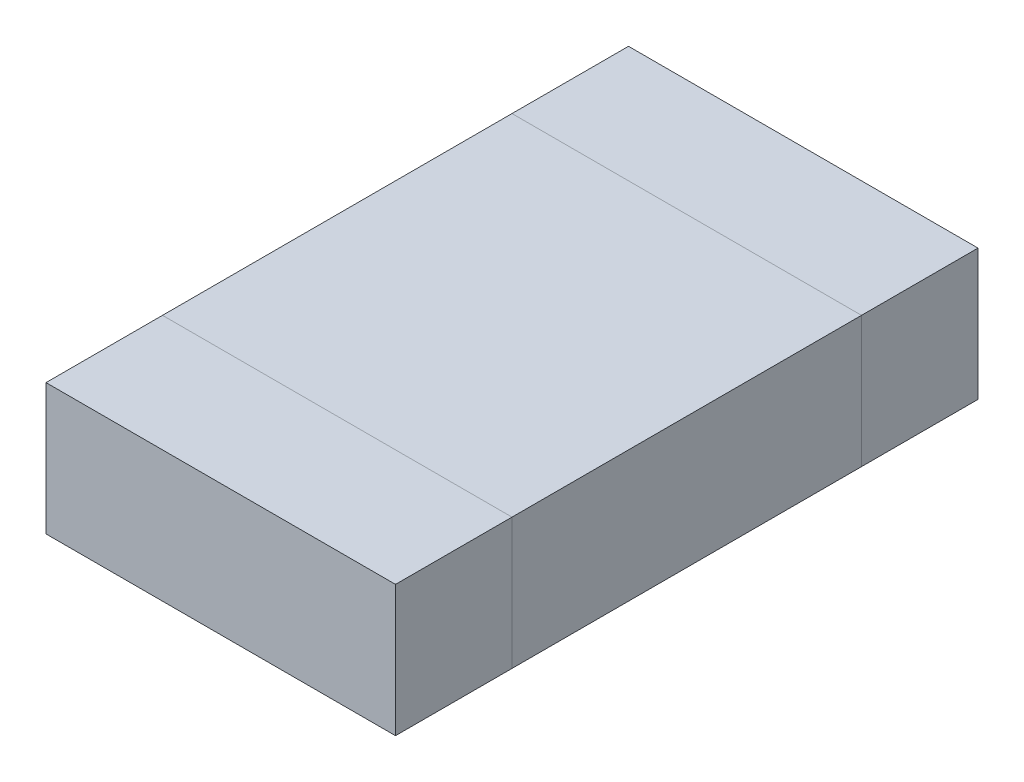
ISO-10303-21;
HEADER;
FILE_DESCRIPTION(('STEP AP214'),'2;1');
FILE_NAME('part.step','',(''),(''),'','','');
FILE_SCHEMA(('AUTOMOTIVE_DESIGN { 1 0 10303 214 1 1 1 1 }'));
ENDSEC;
DATA;
#1=APPLICATION_CONTEXT('core data for automotive mechanical design processes');
#2=APPLICATION_PROTOCOL_DEFINITION('international standard','automotive_design',2000,#1);
#3=PRODUCT_CONTEXT('',#1,'mechanical');
#4=PRODUCT('Part','Part','',(#3));
#5=PRODUCT_RELATED_PRODUCT_CATEGORY('part','',(#4));
#6=PRODUCT_DEFINITION_FORMATION('','',#4);
#7=PRODUCT_DEFINITION_CONTEXT('part definition',#1,'design');
#8=PRODUCT_DEFINITION('design','',#6,#7);
#9=PRODUCT_DEFINITION_SHAPE('','',#8);
#10=(LENGTH_UNIT() NAMED_UNIT(*) SI_UNIT(.MILLI.,.METRE.));
#11=(NAMED_UNIT(*) PLANE_ANGLE_UNIT() SI_UNIT($,.RADIAN.));
#12=(NAMED_UNIT(*) SI_UNIT($,.STERADIAN.) SOLID_ANGLE_UNIT());
#13=UNCERTAINTY_MEASURE_WITH_UNIT(LENGTH_MEASURE(1.E-05),#10,'distance_accuracy_value','');
#14=(GEOMETRIC_REPRESENTATION_CONTEXT(3) GLOBAL_UNCERTAINTY_ASSIGNED_CONTEXT((#13)) GLOBAL_UNIT_ASSIGNED_CONTEXT((#10,
#11,#12)) REPRESENTATION_CONTEXT('',''));
#15=CARTESIAN_POINT('',(0.,0.,0.));
#16=DIRECTION('',(0.,0.,1.));
#17=DIRECTION('',(1.,0.,0.));
#18=AXIS2_PLACEMENT_3D('',#15,#16,#17);
#19=CARTESIAN_POINT('',(0.,0.45,0.));
#20=DIRECTION('',(0.,1.,0.));
#21=DIRECTION('',(0.,0.,1.));
#22=AXIS2_PLACEMENT_3D('',#19,#20,#21);
#23=PLANE('',#22);
#24=DIRECTION('',(0.,0.,-1.));
#25=VECTOR('',#24,1.);
#26=CARTESIAN_POINT('',(-0.6,0.45,-0.6));
#27=LINE('',#26,#25);
#28=CARTESIAN_POINT('',(-0.6,0.45,-0.6));
#29=VERTEX_POINT('',#28);
#30=CARTESIAN_POINT('',(-0.6,0.45,-1.));
#31=VERTEX_POINT('',#30);
#32=EDGE_CURVE('E52',#29,#31,#27,.T.);
#33=ORIENTED_EDGE('',*,*,#32,.F.);
#34=DIRECTION('',(-1.,0.,0.));
#35=VECTOR('',#34,1.);
#36=CARTESIAN_POINT('',(-0.6,0.45,-0.6));
#37=LINE('',#36,#35);
#38=CARTESIAN_POINT('',(0.6,0.45,-0.6));
#39=VERTEX_POINT('',#38);
#40=EDGE_CURVE('E75',#39,#29,#37,.T.);
#41=ORIENTED_EDGE('',*,*,#40,.F.);
#42=DIRECTION('',(0.,0.,1.));
#43=VECTOR('',#42,1.);
#44=CARTESIAN_POINT('',(0.6,0.45,-0.6));
#45=LINE('',#44,#43);
#46=CARTESIAN_POINT('',(0.6,0.45,-1.));
#47=VERTEX_POINT('',#46);
#48=EDGE_CURVE('E80',#47,#39,#45,.T.);
#49=ORIENTED_EDGE('',*,*,#48,.F.);
#50=DIRECTION('',(1.,0.,0.));
#51=VECTOR('',#50,1.);
#52=CARTESIAN_POINT('',(-0.6,0.45,-1.));
#53=LINE('',#52,#51);
#54=EDGE_CURVE('E95',#31,#47,#53,.T.);
#55=ORIENTED_EDGE('',*,*,#54,.F.);
#56=EDGE_LOOP('',(#33,#41,#49,#55));
#57=FACE_BOUND('',#56,.T.);
#58=ADVANCED_FACE('F44',(#57),#23,.T.);
#59=CARTESIAN_POINT('',(0.,0.,0.));
#60=DIRECTION('',(0.,-1.,0.));
#61=DIRECTION('',(0.,0.,-1.));
#62=AXIS2_PLACEMENT_3D('',#59,#60,#61);
#63=PLANE('',#62);
#64=DIRECTION('',(0.,0.,-1.));
#65=VECTOR('',#64,1.);
#66=CARTESIAN_POINT('',(-0.6,0.,-0.6));
#67=LINE('',#66,#65);
#68=CARTESIAN_POINT('',(-0.6,0.,-0.6));
#69=VERTEX_POINT('',#68);
#70=CARTESIAN_POINT('',(-0.6,0.,-1.));
#71=VERTEX_POINT('',#70);
#72=EDGE_CURVE('E104',#69,#71,#67,.T.);
#73=ORIENTED_EDGE('',*,*,#72,.T.);
#74=DIRECTION('',(1.,0.,0.));
#75=VECTOR('',#74,1.);
#76=CARTESIAN_POINT('',(-0.6,0.,-1.));
#77=LINE('',#76,#75);
#78=CARTESIAN_POINT('',(0.6,0.,-1.));
#79=VERTEX_POINT('',#78);
#80=EDGE_CURVE('E93',#71,#79,#77,.T.);
#81=ORIENTED_EDGE('',*,*,#80,.T.);
#82=DIRECTION('',(0.,0.,1.));
#83=VECTOR('',#82,1.);
#84=CARTESIAN_POINT('',(0.6,0.,-0.6));
#85=LINE('',#84,#83);
#86=CARTESIAN_POINT('',(0.6,0.,-0.6));
#87=VERTEX_POINT('',#86);
#88=EDGE_CURVE('E96',#79,#87,#85,.T.);
#89=ORIENTED_EDGE('',*,*,#88,.T.);
#90=DIRECTION('',(-1.,0.,0.));
#91=VECTOR('',#90,1.);
#92=CARTESIAN_POINT('',(-0.6,0.,-0.6));
#93=LINE('',#92,#91);
#94=EDGE_CURVE('E101',#87,#69,#93,.T.);
#95=ORIENTED_EDGE('',*,*,#94,.T.);
#96=EDGE_LOOP('',(#73,#81,#89,#95));
#97=FACE_BOUND('',#96,.T.);
#98=ADVANCED_FACE('F103',(#97),#63,.T.);
#99=CARTESIAN_POINT('',(-0.6,1.71491106406735,-1.));
#100=DIRECTION('',(0.,0.,-1.));
#101=DIRECTION('',(-1.,0.,0.));
#102=AXIS2_PLACEMENT_3D('',#99,#100,#101);
#103=PLANE('',#102);
#104=DIRECTION('',(0.,-1.,0.));
#105=VECTOR('',#104,1.);
#106=CARTESIAN_POINT('',(-0.6,1.71491106406735,-1.));
#107=LINE('',#106,#105);
#108=EDGE_CURVE('E12',#31,#71,#107,.T.);
#109=ORIENTED_EDGE('',*,*,#108,.F.);
#110=ORIENTED_EDGE('',*,*,#54,.T.);
#111=DIRECTION('',(0.,-1.,0.));
#112=VECTOR('',#111,1.);
#113=CARTESIAN_POINT('',(0.6,1.71491106406735,-1.));
#114=LINE('',#113,#112);
#115=EDGE_CURVE('E90',#47,#79,#114,.T.);
#116=ORIENTED_EDGE('',*,*,#115,.T.);
#117=ORIENTED_EDGE('',*,*,#80,.F.);
#118=EDGE_LOOP('',(#109,#110,#116,#117));
#119=FACE_BOUND('',#118,.T.);
#120=ADVANCED_FACE('F91',(#119),#103,.T.);
#121=CARTESIAN_POINT('',(0.6,1.71491106406735,-0.6));
#122=DIRECTION('',(1.,0.,0.));
#123=DIRECTION('',(0.,0.,-1.));
#124=AXIS2_PLACEMENT_3D('',#121,#122,#123);
#125=PLANE('',#124);
#126=ORIENTED_EDGE('',*,*,#115,.F.);
#127=ORIENTED_EDGE('',*,*,#48,.T.);
#128=DIRECTION('',(0.,-1.,0.));
#129=VECTOR('',#128,1.);
#130=CARTESIAN_POINT('',(0.6,1.71491106406735,-0.6));
#131=LINE('',#130,#129);
#132=EDGE_CURVE('E85',#39,#87,#131,.T.);
#133=ORIENTED_EDGE('',*,*,#132,.T.);
#134=ORIENTED_EDGE('',*,*,#88,.F.);
#135=EDGE_LOOP('',(#126,#127,#133,#134));
#136=FACE_BOUND('',#135,.T.);
#137=ADVANCED_FACE('F97',(#136),#125,.T.);
#138=CARTESIAN_POINT('',(-0.6,1.71491106406735,-0.6));
#139=DIRECTION('',(0.,0.,1.));
#140=DIRECTION('',(1.,0.,0.));
#141=AXIS2_PLACEMENT_3D('',#138,#139,#140);
#142=PLANE('',#141);
#143=ORIENTED_EDGE('',*,*,#132,.F.);
#144=ORIENTED_EDGE('',*,*,#40,.T.);
#145=DIRECTION('',(0.,-1.,0.));
#146=VECTOR('',#145,1.);
#147=CARTESIAN_POINT('',(-0.6,1.71491106406735,-0.6));
#148=LINE('',#147,#146);
#149=EDGE_CURVE('E111',#29,#69,#148,.T.);
#150=ORIENTED_EDGE('',*,*,#149,.T.);
#151=ORIENTED_EDGE('',*,*,#94,.F.);
#152=EDGE_LOOP('',(#143,#144,#150,#151));
#153=FACE_BOUND('',#152,.T.);
#154=ADVANCED_FACE('F117',(#153),#142,.T.);
#155=CARTESIAN_POINT('',(-0.6,1.71491106406735,-0.6));
#156=DIRECTION('',(-1.,0.,0.));
#157=DIRECTION('',(0.,0.,1.));
#158=AXIS2_PLACEMENT_3D('',#155,#156,#157);
#159=PLANE('',#158);
#160=ORIENTED_EDGE('',*,*,#149,.F.);
#161=ORIENTED_EDGE('',*,*,#32,.T.);
#162=ORIENTED_EDGE('',*,*,#108,.T.);
#163=ORIENTED_EDGE('',*,*,#72,.F.);
#164=EDGE_LOOP('',(#160,#161,#162,#163));
#165=FACE_BOUND('',#164,.T.);
#166=ADVANCED_FACE('F118',(#165),#159,.T.);
#167=CLOSED_SHELL('',(#58,#98,#120,#137,#154,#166));
#168=MANIFOLD_SOLID_BREP('B2',#167);
#169=CARTESIAN_POINT('',(0.,0.45,0.));
#170=DIRECTION('',(0.,1.,0.));
#171=DIRECTION('',(0.,0.,1.));
#172=AXIS2_PLACEMENT_3D('',#169,#170,#171);
#173=PLANE('',#172);
#174=DIRECTION('',(0.,0.,-1.));
#175=VECTOR('',#174,1.);
#176=CARTESIAN_POINT('',(-0.6,0.45,0.6));
#177=LINE('',#176,#175);
#178=CARTESIAN_POINT('',(-0.6,0.45,1.));
#179=VERTEX_POINT('',#178);
#180=CARTESIAN_POINT('',(-0.6,0.45,0.6));
#181=VERTEX_POINT('',#180);
#182=EDGE_CURVE('E185',#179,#181,#177,.T.);
#183=ORIENTED_EDGE('',*,*,#182,.F.);
#184=DIRECTION('',(-1.,0.,0.));
#185=VECTOR('',#184,1.);
#186=CARTESIAN_POINT('',(-0.6,0.45,1.));
#187=LINE('',#186,#185);
#188=CARTESIAN_POINT('',(0.6,0.45,1.));
#189=VERTEX_POINT('',#188);
#190=EDGE_CURVE('E208',#189,#179,#187,.T.);
#191=ORIENTED_EDGE('',*,*,#190,.F.);
#192=DIRECTION('',(0.,0.,1.));
#193=VECTOR('',#192,1.);
#194=CARTESIAN_POINT('',(0.6,0.45,0.6));
#195=LINE('',#194,#193);
#196=CARTESIAN_POINT('',(0.6,0.45,0.6));
#197=VERTEX_POINT('',#196);
#198=EDGE_CURVE('E213',#197,#189,#195,.T.);
#199=ORIENTED_EDGE('',*,*,#198,.F.);
#200=DIRECTION('',(1.,0.,0.));
#201=VECTOR('',#200,1.);
#202=CARTESIAN_POINT('',(-0.6,0.45,0.6));
#203=LINE('',#202,#201);
#204=EDGE_CURVE('E228',#181,#197,#203,.T.);
#205=ORIENTED_EDGE('',*,*,#204,.F.);
#206=EDGE_LOOP('',(#183,#191,#199,#205));
#207=FACE_BOUND('',#206,.T.);
#208=ADVANCED_FACE('F177',(#207),#173,.T.);
#209=CARTESIAN_POINT('',(0.,0.,0.));
#210=DIRECTION('',(0.,1.,0.));
#211=DIRECTION('',(0.,0.,1.));
#212=AXIS2_PLACEMENT_3D('',#209,#210,#211);
#213=PLANE('',#212);
#214=DIRECTION('',(0.,0.,-1.));
#215=VECTOR('',#214,1.);
#216=CARTESIAN_POINT('',(-0.6,0.,0.6));
#217=LINE('',#216,#215);
#218=CARTESIAN_POINT('',(-0.6,0.,1.));
#219=VERTEX_POINT('',#218);
#220=CARTESIAN_POINT('',(-0.6,0.,0.6));
#221=VERTEX_POINT('',#220);
#222=EDGE_CURVE('E237',#219,#221,#217,.T.);
#223=ORIENTED_EDGE('',*,*,#222,.T.);
#224=DIRECTION('',(1.,0.,0.));
#225=VECTOR('',#224,1.);
#226=CARTESIAN_POINT('',(-0.6,0.,0.6));
#227=LINE('',#226,#225);
#228=CARTESIAN_POINT('',(0.6,0.,0.6));
#229=VERTEX_POINT('',#228);
#230=EDGE_CURVE('E226',#221,#229,#227,.T.);
#231=ORIENTED_EDGE('',*,*,#230,.T.);
#232=DIRECTION('',(0.,0.,1.));
#233=VECTOR('',#232,1.);
#234=CARTESIAN_POINT('',(0.6,0.,0.6));
#235=LINE('',#234,#233);
#236=CARTESIAN_POINT('',(0.6,0.,1.));
#237=VERTEX_POINT('',#236);
#238=EDGE_CURVE('E229',#229,#237,#235,.T.);
#239=ORIENTED_EDGE('',*,*,#238,.T.);
#240=DIRECTION('',(-1.,0.,0.));
#241=VECTOR('',#240,1.);
#242=CARTESIAN_POINT('',(-0.6,0.,1.));
#243=LINE('',#242,#241);
#244=EDGE_CURVE('E234',#237,#219,#243,.T.);
#245=ORIENTED_EDGE('',*,*,#244,.T.);
#246=EDGE_LOOP('',(#223,#231,#239,#245));
#247=FACE_BOUND('',#246,.T.);
#248=ADVANCED_FACE('F236',(#247),#213,.F.);
#249=CARTESIAN_POINT('',(-0.6,1.71491106406735,0.6));
#250=DIRECTION('',(0.,0.,-1.));
#251=DIRECTION('',(-1.,0.,0.));
#252=AXIS2_PLACEMENT_3D('',#249,#250,#251);
#253=PLANE('',#252);
#254=DIRECTION('',(0.,-1.,0.));
#255=VECTOR('',#254,1.);
#256=CARTESIAN_POINT('',(-0.6,1.71491106406735,0.6));
#257=LINE('',#256,#255);
#258=EDGE_CURVE('E42',#181,#221,#257,.T.);
#259=ORIENTED_EDGE('',*,*,#258,.F.);
#260=ORIENTED_EDGE('',*,*,#204,.T.);
#261=DIRECTION('',(0.,-1.,0.));
#262=VECTOR('',#261,1.);
#263=CARTESIAN_POINT('',(0.6,1.71491106406735,0.6));
#264=LINE('',#263,#262);
#265=EDGE_CURVE('E223',#197,#229,#264,.T.);
#266=ORIENTED_EDGE('',*,*,#265,.T.);
#267=ORIENTED_EDGE('',*,*,#230,.F.);
#268=EDGE_LOOP('',(#259,#260,#266,#267));
#269=FACE_BOUND('',#268,.T.);
#270=ADVANCED_FACE('F224',(#269),#253,.T.);
#271=CARTESIAN_POINT('',(0.6,1.71491106406735,0.6));
#272=DIRECTION('',(1.,0.,0.));
#273=DIRECTION('',(0.,0.,-1.));
#274=AXIS2_PLACEMENT_3D('',#271,#272,#273);
#275=PLANE('',#274);
#276=ORIENTED_EDGE('',*,*,#265,.F.);
#277=ORIENTED_EDGE('',*,*,#198,.T.);
#278=DIRECTION('',(0.,-1.,0.));
#279=VECTOR('',#278,1.);
#280=CARTESIAN_POINT('',(0.6,1.71491106406735,1.));
#281=LINE('',#280,#279);
#282=EDGE_CURVE('E218',#189,#237,#281,.T.);
#283=ORIENTED_EDGE('',*,*,#282,.T.);
#284=ORIENTED_EDGE('',*,*,#238,.F.);
#285=EDGE_LOOP('',(#276,#277,#283,#284));
#286=FACE_BOUND('',#285,.T.);
#287=ADVANCED_FACE('F230',(#286),#275,.T.);
#288=CARTESIAN_POINT('',(-0.6,1.71491106406735,1.));
#289=DIRECTION('',(0.,0.,1.));
#290=DIRECTION('',(1.,0.,0.));
#291=AXIS2_PLACEMENT_3D('',#288,#289,#290);
#292=PLANE('',#291);
#293=ORIENTED_EDGE('',*,*,#282,.F.);
#294=ORIENTED_EDGE('',*,*,#190,.T.);
#295=DIRECTION('',(0.,-1.,0.));
#296=VECTOR('',#295,1.);
#297=CARTESIAN_POINT('',(-0.6,1.71491106406735,1.));
#298=LINE('',#297,#296);
#299=EDGE_CURVE('E244',#179,#219,#298,.T.);
#300=ORIENTED_EDGE('',*,*,#299,.T.);
#301=ORIENTED_EDGE('',*,*,#244,.F.);
#302=EDGE_LOOP('',(#293,#294,#300,#301));
#303=FACE_BOUND('',#302,.T.);
#304=ADVANCED_FACE('F250',(#303),#292,.T.);
#305=CARTESIAN_POINT('',(-0.6,1.71491106406735,0.6));
#306=DIRECTION('',(-1.,0.,0.));
#307=DIRECTION('',(0.,0.,1.));
#308=AXIS2_PLACEMENT_3D('',#305,#306,#307);
#309=PLANE('',#308);
#310=ORIENTED_EDGE('',*,*,#299,.F.);
#311=ORIENTED_EDGE('',*,*,#182,.T.);
#312=ORIENTED_EDGE('',*,*,#258,.T.);
#313=ORIENTED_EDGE('',*,*,#222,.F.);
#314=EDGE_LOOP('',(#310,#311,#312,#313));
#315=FACE_BOUND('',#314,.T.);
#316=ADVANCED_FACE('F251',(#315),#309,.T.);
#317=CLOSED_SHELL('',(#208,#248,#270,#287,#304,#316));
#318=MANIFOLD_SOLID_BREP('B6',#317);
#319=CARTESIAN_POINT('',(0.6,0.45,-0.6));
#320=DIRECTION('',(-1.,0.,0.));
#321=DIRECTION('',(0.,0.,1.));
#322=AXIS2_PLACEMENT_3D('',#319,#320,#321);
#323=PLANE('',#322);
#324=DIRECTION('',(0.,0.,-1.));
#325=VECTOR('',#324,1.);
#326=CARTESIAN_POINT('',(0.6,0.,-0.6));
#327=LINE('',#326,#325);
#328=CARTESIAN_POINT('',(0.6,0.,0.6));
#329=VERTEX_POINT('',#328);
#330=CARTESIAN_POINT('',(0.6,0.,-0.6));
#331=VERTEX_POINT('',#330);
#332=EDGE_CURVE('E364',#329,#331,#327,.T.);
#333=ORIENTED_EDGE('',*,*,#332,.T.);
#334=DIRECTION('',(0.,-1.,0.));
#335=VECTOR('',#334,1.);
#336=CARTESIAN_POINT('',(0.6,0.45,-0.6));
#337=LINE('',#336,#335);
#338=CARTESIAN_POINT('',(0.6,0.45,-0.6));
#339=VERTEX_POINT('',#338);
#340=EDGE_CURVE('E175',#339,#331,#337,.T.);
#341=ORIENTED_EDGE('',*,*,#340,.F.);
#342=DIRECTION('',(0.,0.,-1.));
#343=VECTOR('',#342,1.);
#344=CARTESIAN_POINT('',(0.6,0.45,-0.6));
#345=LINE('',#344,#343);
#346=CARTESIAN_POINT('',(0.6,0.45,0.6));
#347=VERTEX_POINT('',#346);
#348=EDGE_CURVE('E352',#347,#339,#345,.T.);
#349=ORIENTED_EDGE('',*,*,#348,.F.);
#350=DIRECTION('',(0.,-1.,0.));
#351=VECTOR('',#350,1.);
#352=CARTESIAN_POINT('',(0.6,0.45,0.6));
#353=LINE('',#352,#351);
#354=EDGE_CURVE('E360',#347,#329,#353,.T.);
#355=ORIENTED_EDGE('',*,*,#354,.T.);
#356=EDGE_LOOP('',(#333,#341,#349,#355));
#357=FACE_BOUND('',#356,.T.);
#358=ADVANCED_FACE('F301',(#357),#323,.F.);
#359=CARTESIAN_POINT('',(-0.6,0.45,-0.6));
#360=DIRECTION('',(0.,0.,1.));
#361=DIRECTION('',(1.,0.,0.));
#362=AXIS2_PLACEMENT_3D('',#359,#360,#361);
#363=PLANE('',#362);
#364=DIRECTION('',(-1.,0.,0.));
#365=VECTOR('',#364,1.);
#366=CARTESIAN_POINT('',(-0.6,0.,-0.6));
#367=LINE('',#366,#365);
#368=CARTESIAN_POINT('',(-0.6,0.,-0.6));
#369=VERTEX_POINT('',#368);
#370=EDGE_CURVE('E356',#331,#369,#367,.T.);
#371=ORIENTED_EDGE('',*,*,#370,.T.);
#372=DIRECTION('',(0.,-1.,0.));
#373=VECTOR('',#372,1.);
#374=CARTESIAN_POINT('',(-0.6,0.45,-0.6));
#375=LINE('',#374,#373);
#376=CARTESIAN_POINT('',(-0.6,0.45,-0.6));
#377=VERTEX_POINT('',#376);
#378=EDGE_CURVE('E309',#377,#369,#375,.T.);
#379=ORIENTED_EDGE('',*,*,#378,.F.);
#380=DIRECTION('',(-1.,0.,0.));
#381=VECTOR('',#380,1.);
#382=CARTESIAN_POINT('',(-0.6,0.45,-0.6));
#383=LINE('',#382,#381);
#384=EDGE_CURVE('E347',#339,#377,#383,.T.);
#385=ORIENTED_EDGE('',*,*,#384,.F.);
#386=ORIENTED_EDGE('',*,*,#340,.T.);
#387=EDGE_LOOP('',(#371,#379,#385,#386));
#388=FACE_BOUND('',#387,.T.);
#389=ADVANCED_FACE('F355',(#388),#363,.F.);
#390=CARTESIAN_POINT('',(-0.6,0.45,-0.6));
#391=DIRECTION('',(1.,0.,0.));
#392=DIRECTION('',(0.,0.,-1.));
#393=AXIS2_PLACEMENT_3D('',#390,#391,#392);
#394=PLANE('',#393);
#395=DIRECTION('',(0.,0.,1.));
#396=VECTOR('',#395,1.);
#397=CARTESIAN_POINT('',(-0.6,0.,-0.6));
#398=LINE('',#397,#396);
#399=CARTESIAN_POINT('',(-0.6,0.,0.6));
#400=VERTEX_POINT('',#399);
#401=EDGE_CURVE('E334',#369,#400,#398,.T.);
#402=ORIENTED_EDGE('',*,*,#401,.T.);
#403=DIRECTION('',(0.,-1.,0.));
#404=VECTOR('',#403,1.);
#405=CARTESIAN_POINT('',(-0.6,0.45,0.6));
#406=LINE('',#405,#404);
#407=CARTESIAN_POINT('',(-0.6,0.45,0.6));
#408=VERTEX_POINT('',#407);
#409=EDGE_CURVE('E357',#408,#400,#406,.T.);
#410=ORIENTED_EDGE('',*,*,#409,.F.);
#411=DIRECTION('',(0.,0.,1.));
#412=VECTOR('',#411,1.);
#413=CARTESIAN_POINT('',(-0.6,0.45,-0.6));
#414=LINE('',#413,#412);
#415=EDGE_CURVE('E350',#377,#408,#414,.T.);
#416=ORIENTED_EDGE('',*,*,#415,.F.);
#417=ORIENTED_EDGE('',*,*,#378,.T.);
#418=EDGE_LOOP('',(#402,#410,#416,#417));
#419=FACE_BOUND('',#418,.T.);
#420=ADVANCED_FACE('F358',(#419),#394,.F.);
#421=CARTESIAN_POINT('',(-0.6,0.45,0.6));
#422=DIRECTION('',(0.,0.,-1.));
#423=DIRECTION('',(-1.,0.,0.));
#424=AXIS2_PLACEMENT_3D('',#421,#422,#423);
#425=PLANE('',#424);
#426=DIRECTION('',(1.,0.,0.));
#427=VECTOR('',#426,1.);
#428=CARTESIAN_POINT('',(-0.6,0.,0.6));
#429=LINE('',#428,#427);
#430=EDGE_CURVE('E340',#400,#329,#429,.T.);
#431=ORIENTED_EDGE('',*,*,#430,.T.);
#432=ORIENTED_EDGE('',*,*,#354,.F.);
#433=DIRECTION('',(1.,0.,0.));
#434=VECTOR('',#433,1.);
#435=CARTESIAN_POINT('',(-0.6,0.45,0.6));
#436=LINE('',#435,#434);
#437=EDGE_CURVE('E317',#408,#347,#436,.T.);
#438=ORIENTED_EDGE('',*,*,#437,.F.);
#439=ORIENTED_EDGE('',*,*,#409,.T.);
#440=EDGE_LOOP('',(#431,#432,#438,#439));
#441=FACE_BOUND('',#440,.T.);
#442=ADVANCED_FACE('F371',(#441),#425,.F.);
#443=CARTESIAN_POINT('',(0.,0.45,0.));
#444=DIRECTION('',(0.,1.,0.));
#445=DIRECTION('',(0.,0.,1.));
#446=AXIS2_PLACEMENT_3D('',#443,#444,#445);
#447=PLANE('',#446);
#448=ORIENTED_EDGE('',*,*,#348,.T.);
#449=ORIENTED_EDGE('',*,*,#384,.T.);
#450=ORIENTED_EDGE('',*,*,#415,.T.);
#451=ORIENTED_EDGE('',*,*,#437,.T.);
#452=EDGE_LOOP('',(#448,#449,#450,#451));
#453=FACE_BOUND('',#452,.T.);
#454=ADVANCED_FACE('F348',(#453),#447,.T.);
#455=CARTESIAN_POINT('',(0.,0.,0.));
#456=DIRECTION('',(0.,1.,0.));
#457=DIRECTION('',(0.,0.,1.));
#458=AXIS2_PLACEMENT_3D('',#455,#456,#457);
#459=PLANE('',#458);
#460=ORIENTED_EDGE('',*,*,#332,.F.);
#461=ORIENTED_EDGE('',*,*,#430,.F.);
#462=ORIENTED_EDGE('',*,*,#401,.F.);
#463=ORIENTED_EDGE('',*,*,#370,.F.);
#464=EDGE_LOOP('',(#460,#461,#462,#463));
#465=FACE_BOUND('',#464,.T.);
#466=ADVANCED_FACE('F374',(#465),#459,.F.);
#467=CLOSED_SHELL('',(#358,#389,#420,#442,#454,#466));
#468=MANIFOLD_SOLID_BREP('B36',#467);
#469=ADVANCED_BREP_SHAPE_REPRESENTATION('',(#18,#168,#318,#468),#14);
#470=SHAPE_DEFINITION_REPRESENTATION(#9,#469);
ENDSEC;
END-ISO-10303-21;
